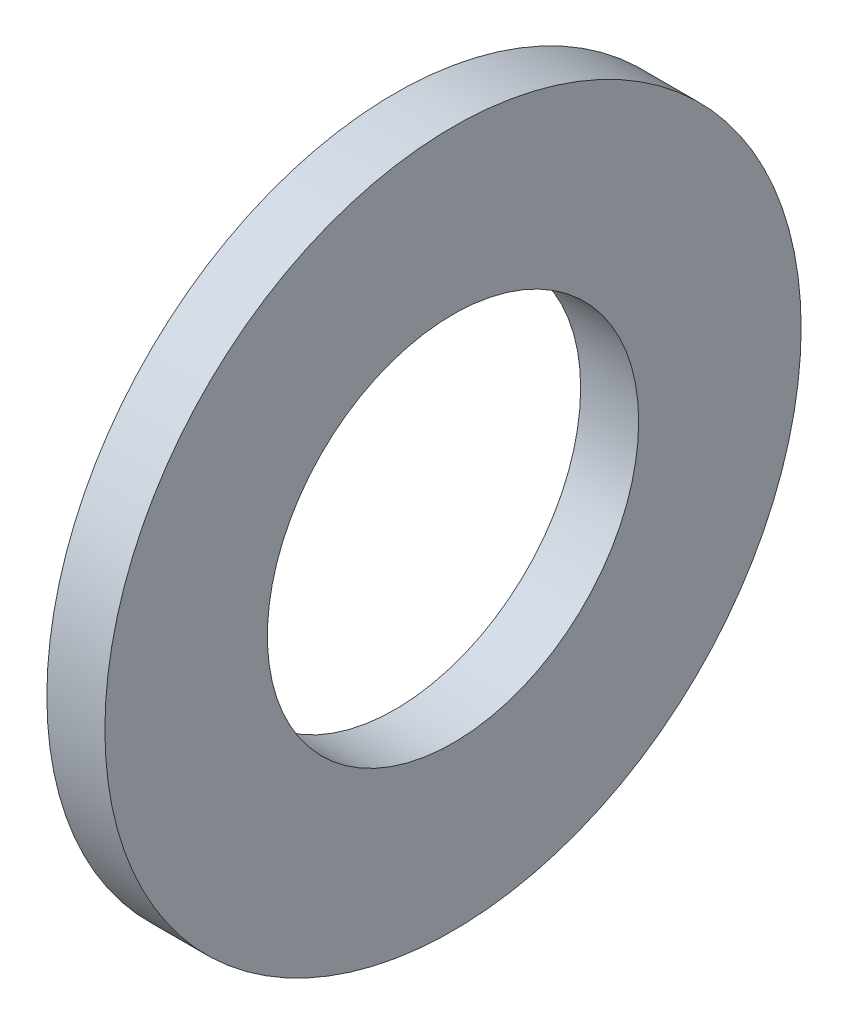
ISO-10303-21;
HEADER;
FILE_DESCRIPTION(('STEP AP214'),'2;1');
FILE_NAME('part.step','',(''),(''),'','','');
FILE_SCHEMA(('AUTOMOTIVE_DESIGN { 1 0 10303 214 1 1 1 1 }'));
ENDSEC;
DATA;
#1=APPLICATION_CONTEXT('core data for automotive mechanical design processes');
#2=APPLICATION_PROTOCOL_DEFINITION('international standard','automotive_design',2000,#1);
#3=PRODUCT_CONTEXT('',#1,'mechanical');
#4=PRODUCT('Part','Part','',(#3));
#5=PRODUCT_RELATED_PRODUCT_CATEGORY('part','',(#4));
#6=PRODUCT_DEFINITION_FORMATION('','',#4);
#7=PRODUCT_DEFINITION_CONTEXT('part definition',#1,'design');
#8=PRODUCT_DEFINITION('design','',#6,#7);
#9=PRODUCT_DEFINITION_SHAPE('','',#8);
#10=(LENGTH_UNIT() NAMED_UNIT(*) SI_UNIT(.MILLI.,.METRE.));
#11=(NAMED_UNIT(*) PLANE_ANGLE_UNIT() SI_UNIT($,.RADIAN.));
#12=(NAMED_UNIT(*) SI_UNIT($,.STERADIAN.) SOLID_ANGLE_UNIT());
#13=UNCERTAINTY_MEASURE_WITH_UNIT(LENGTH_MEASURE(1.E-05),#10,'distance_accuracy_value','');
#14=(GEOMETRIC_REPRESENTATION_CONTEXT(3) GLOBAL_UNCERTAINTY_ASSIGNED_CONTEXT((#13)) GLOBAL_UNIT_ASSIGNED_CONTEXT((#10,
#11,#12)) REPRESENTATION_CONTEXT('',''));
#15=CARTESIAN_POINT('',(0.,0.,0.));
#16=DIRECTION('',(0.,0.,1.));
#17=DIRECTION('',(1.,0.,0.));
#18=AXIS2_PLACEMENT_3D('',#15,#16,#17);
#19=CARTESIAN_POINT('',(20.5,-29.,-19.5));
#20=DIRECTION('',(-1.,0.,0.));
#21=DIRECTION('',(0.,0.,1.));
#22=AXIS2_PLACEMENT_3D('',#19,#20,#21);
#23=CYLINDRICAL_SURFACE('',#22,6.);
#24=CARTESIAN_POINT('',(20.5,-29.,-19.5));
#25=DIRECTION('',(1.,0.,0.));
#26=DIRECTION('',(0.,0.,-1.));
#27=AXIS2_PLACEMENT_3D('',#24,#25,#26);
#28=CIRCLE('',#27,6.);
#29=CARTESIAN_POINT('',(20.5,-29.,-25.5));
#30=VERTEX_POINT('',#29);
#31=EDGE_CURVE('E10',#30,#30,#28,.T.);
#32=ORIENTED_EDGE('',*,*,#31,.F.);
#33=EDGE_LOOP('',(#32));
#34=FACE_BOUND('',#33,.T.);
#35=CARTESIAN_POINT('',(19.5,-29.,-19.5));
#36=DIRECTION('',(1.,0.,0.));
#37=DIRECTION('',(0.,0.,-1.));
#38=AXIS2_PLACEMENT_3D('',#35,#36,#37);
#39=CIRCLE('',#38,6.);
#40=CARTESIAN_POINT('',(19.5,-29.,-25.5));
#41=VERTEX_POINT('',#40);
#42=EDGE_CURVE('E46',#41,#41,#39,.T.);
#43=ORIENTED_EDGE('',*,*,#42,.T.);
#44=EDGE_LOOP('',(#43));
#45=FACE_BOUND('',#44,.T.);
#46=ADVANCED_FACE('F39',(#34,#45),#23,.T.);
#47=CARTESIAN_POINT('',(20.5,-29.,-19.5));
#48=DIRECTION('',(1.,0.,0.));
#49=DIRECTION('',(0.,0.,-1.));
#50=AXIS2_PLACEMENT_3D('',#47,#48,#49);
#51=PLANE('',#50);
#52=CARTESIAN_POINT('',(20.5,-29.,-19.5));
#53=DIRECTION('',(1.,0.,0.));
#54=DIRECTION('',(0.,0.,-1.));
#55=AXIS2_PLACEMENT_3D('',#52,#53,#54);
#56=CIRCLE('',#55,3.2);
#57=CARTESIAN_POINT('',(20.5,-29.,-22.7));
#58=VERTEX_POINT('',#57);
#59=EDGE_CURVE('E51',#58,#58,#56,.F.);
#60=ORIENTED_EDGE('',*,*,#59,.T.);
#61=EDGE_LOOP('',(#60));
#62=FACE_BOUND('',#61,.T.);
#63=ORIENTED_EDGE('',*,*,#31,.T.);
#64=EDGE_LOOP('',(#63));
#65=FACE_BOUND('',#64,.T.);
#66=ADVANCED_FACE('F63',(#62,#65),#51,.T.);
#67=CARTESIAN_POINT('',(19.5,-29.,-19.5));
#68=DIRECTION('',(1.,0.,0.));
#69=DIRECTION('',(0.,0.,-1.));
#70=AXIS2_PLACEMENT_3D('',#67,#68,#69);
#71=PLANE('',#70);
#72=CARTESIAN_POINT('',(19.5,-29.,-19.5));
#73=DIRECTION('',(1.,0.,0.));
#74=DIRECTION('',(0.,0.,-1.));
#75=AXIS2_PLACEMENT_3D('',#72,#73,#74);
#76=CIRCLE('',#75,3.2);
#77=CARTESIAN_POINT('',(19.5,-29.,-22.7));
#78=VERTEX_POINT('',#77);
#79=EDGE_CURVE('E45',#78,#78,#76,.F.);
#80=ORIENTED_EDGE('',*,*,#79,.F.);
#81=EDGE_LOOP('',(#80));
#82=FACE_BOUND('',#81,.T.);
#83=ORIENTED_EDGE('',*,*,#42,.F.);
#84=EDGE_LOOP('',(#83));
#85=FACE_BOUND('',#84,.T.);
#86=ADVANCED_FACE('F61',(#82,#85),#71,.F.);
#87=CARTESIAN_POINT('',(20.6,-29.,-19.5));
#88=DIRECTION('',(-1.,0.,0.));
#89=DIRECTION('',(0.,0.,1.));
#90=AXIS2_PLACEMENT_3D('',#87,#88,#89);
#91=CYLINDRICAL_SURFACE('',#90,3.2);
#92=ORIENTED_EDGE('',*,*,#59,.F.);
#93=EDGE_LOOP('',(#92));
#94=FACE_BOUND('',#93,.T.);
#95=ORIENTED_EDGE('',*,*,#79,.T.);
#96=EDGE_LOOP('',(#95));
#97=FACE_BOUND('',#96,.T.);
#98=ADVANCED_FACE('F56',(#94,#97),#91,.F.);
#99=CLOSED_SHELL('',(#46,#66,#86,#98));
#100=MANIFOLD_SOLID_BREP('B2',#99);
#101=ADVANCED_BREP_SHAPE_REPRESENTATION('',(#18,#100),#14);
#102=SHAPE_DEFINITION_REPRESENTATION(#9,#101);
ENDSEC;
END-ISO-10303-21;
